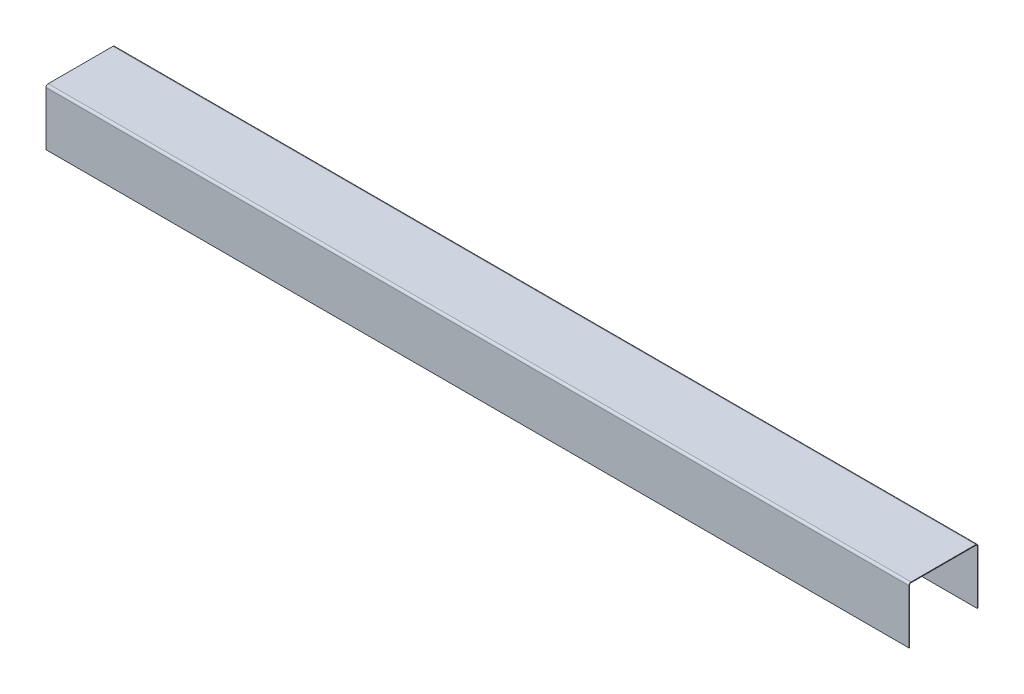
ISO-10303-21;
HEADER;
FILE_DESCRIPTION(('STEP AP214'),'2;1');
FILE_NAME('part.step','',(''),(''),'','','');
FILE_SCHEMA(('AUTOMOTIVE_DESIGN { 1 0 10303 214 1 1 1 1 }'));
ENDSEC;
DATA;
#1=APPLICATION_CONTEXT('core data for automotive mechanical design processes');
#2=APPLICATION_PROTOCOL_DEFINITION('international standard','automotive_design',2000,#1);
#3=PRODUCT_CONTEXT('',#1,'mechanical');
#4=PRODUCT('Part','Part','',(#3));
#5=PRODUCT_RELATED_PRODUCT_CATEGORY('part','',(#4));
#6=PRODUCT_DEFINITION_FORMATION('','',#4);
#7=PRODUCT_DEFINITION_CONTEXT('part definition',#1,'design');
#8=PRODUCT_DEFINITION('design','',#6,#7);
#9=PRODUCT_DEFINITION_SHAPE('','',#8);
#10=(LENGTH_UNIT() NAMED_UNIT(*) SI_UNIT(.MILLI.,.METRE.));
#11=(NAMED_UNIT(*) PLANE_ANGLE_UNIT() SI_UNIT($,.RADIAN.));
#12=(NAMED_UNIT(*) SI_UNIT($,.STERADIAN.) SOLID_ANGLE_UNIT());
#13=UNCERTAINTY_MEASURE_WITH_UNIT(LENGTH_MEASURE(1.E-05),#10,'distance_accuracy_value','');
#14=(GEOMETRIC_REPRESENTATION_CONTEXT(3) GLOBAL_UNCERTAINTY_ASSIGNED_CONTEXT((#13)) GLOBAL_UNIT_ASSIGNED_CONTEXT((#10,
#11,#12)) REPRESENTATION_CONTEXT('',''));
#15=CARTESIAN_POINT('',(0.,0.,0.));
#16=DIRECTION('',(0.,0.,1.));
#17=DIRECTION('',(1.,0.,0.));
#18=AXIS2_PLACEMENT_3D('',#15,#16,#17);
#19=CARTESIAN_POINT('',(0.,-65.,0.));
#20=DIRECTION('',(0.,-1.,0.));
#21=DIRECTION('',(0.,0.,-1.));
#22=AXIS2_PLACEMENT_3D('',#19,#20,#21);
#23=PLANE('',#22);
#24=DIRECTION('',(-1.,0.,0.));
#25=VECTOR('',#24,1.);
#26=CARTESIAN_POINT('',(0.,-65.,39.2));
#27=LINE('',#26,#25);
#28=CARTESIAN_POINT('',(990.,-65.,39.2));
#29=VERTEX_POINT('',#28);
#30=CARTESIAN_POINT('',(-9.99999999999999,-65.,39.2));
#31=VERTEX_POINT('',#30);
#32=EDGE_CURVE('E208',#29,#31,#27,.T.);
#33=ORIENTED_EDGE('',*,*,#32,.F.);
#34=DIRECTION('',(0.,0.,-1.));
#35=VECTOR('',#34,1.);
#36=CARTESIAN_POINT('',(990.,-65.,-39.9999999999999));
#37=LINE('',#36,#35);
#38=CARTESIAN_POINT('',(990.,-65.,39.9999999999999));
#39=VERTEX_POINT('',#38);
#40=EDGE_CURVE('E160',#39,#29,#37,.T.);
#41=ORIENTED_EDGE('',*,*,#40,.F.);
#42=DIRECTION('',(1.,0.,0.));
#43=VECTOR('',#42,1.);
#44=CARTESIAN_POINT('',(990.,-65.,39.9999999999999));
#45=LINE('',#44,#43);
#46=CARTESIAN_POINT('',(-9.99999999999999,-65.,40.));
#47=VERTEX_POINT('',#46);
#48=EDGE_CURVE('E171',#47,#39,#45,.T.);
#49=ORIENTED_EDGE('',*,*,#48,.F.);
#50=DIRECTION('',(0.,0.,1.));
#51=VECTOR('',#50,1.);
#52=CARTESIAN_POINT('',(-9.99999999999999,-65.,-40.));
#53=LINE('',#52,#51);
#54=EDGE_CURVE('E167',#31,#47,#53,.T.);
#55=ORIENTED_EDGE('',*,*,#54,.F.);
#56=EDGE_LOOP('',(#33,#41,#49,#55));
#57=FACE_BOUND('',#56,.T.);
#58=ADVANCED_FACE('F33',(#57),#23,.T.);
#59=CARTESIAN_POINT('',(990.,-65.,-39.9999999999999));
#60=DIRECTION('',(1.,0.,0.));
#61=DIRECTION('',(0.,0.,-1.));
#62=AXIS2_PLACEMENT_3D('',#59,#60,#61);
#63=PLANE('',#62);
#64=DIRECTION('',(0.,-1.,0.));
#65=VECTOR('',#64,1.);
#66=CARTESIAN_POINT('',(990.,-2.5,39.2));
#67=LINE('',#66,#65);
#68=CARTESIAN_POINT('',(990.,-2.5,39.2));
#69=VERTEX_POINT('',#68);
#70=EDGE_CURVE('E131',#69,#29,#67,.T.);
#71=ORIENTED_EDGE('',*,*,#70,.F.);
#72=CARTESIAN_POINT('',(990.,-2.5,37.5));
#73=DIRECTION('',(1.,0.,0.));
#74=DIRECTION('',(0.,0.,-1.));
#75=AXIS2_PLACEMENT_3D('',#72,#73,#74);
#76=CIRCLE('',#75,1.7);
#77=CARTESIAN_POINT('',(990.,-0.8,37.5));
#78=VERTEX_POINT('',#77);
#79=EDGE_CURVE('E145',#78,#69,#76,.T.);
#80=ORIENTED_EDGE('',*,*,#79,.F.);
#81=DIRECTION('',(0.,0.,1.));
#82=VECTOR('',#81,1.);
#83=CARTESIAN_POINT('',(990.,-0.799999999999999,-37.5));
#84=LINE('',#83,#82);
#85=CARTESIAN_POINT('',(990.,-0.799999999999999,-37.5));
#86=VERTEX_POINT('',#85);
#87=EDGE_CURVE('E143',#86,#78,#84,.T.);
#88=ORIENTED_EDGE('',*,*,#87,.F.);
#89=CARTESIAN_POINT('',(990.,-2.5,-37.5));
#90=DIRECTION('',(1.,0.,0.));
#91=DIRECTION('',(0.,0.,-1.));
#92=AXIS2_PLACEMENT_3D('',#89,#90,#91);
#93=CIRCLE('',#92,1.7);
#94=CARTESIAN_POINT('',(990.,-2.5,-39.2));
#95=VERTEX_POINT('',#94);
#96=EDGE_CURVE('E126',#95,#86,#93,.T.);
#97=ORIENTED_EDGE('',*,*,#96,.F.);
#98=DIRECTION('',(0.,1.,0.));
#99=VECTOR('',#98,1.);
#100=CARTESIAN_POINT('',(990.,-64.2,-39.2));
#101=LINE('',#100,#99);
#102=CARTESIAN_POINT('',(990.,-65.,-39.2));
#103=VERTEX_POINT('',#102);
#104=EDGE_CURVE('E134',#103,#95,#101,.T.);
#105=ORIENTED_EDGE('',*,*,#104,.F.);
#106=CARTESIAN_POINT('',(990.,-65.,-39.9999999999999));
#107=VERTEX_POINT('',#106);
#108=EDGE_CURVE('E164',#103,#107,#37,.T.);
#109=ORIENTED_EDGE('',*,*,#108,.T.);
#110=DIRECTION('',(0.,1.,0.));
#111=VECTOR('',#110,1.);
#112=CARTESIAN_POINT('',(990.,-65.,-39.9999999999999));
#113=LINE('',#112,#111);
#114=CARTESIAN_POINT('',(990.,-2.5,-39.9999999999999));
#115=VERTEX_POINT('',#114);
#116=EDGE_CURVE('E174',#107,#115,#113,.T.);
#117=ORIENTED_EDGE('',*,*,#116,.T.);
#118=CARTESIAN_POINT('',(990.,-2.5,-37.4999999999999));
#119=DIRECTION('',(1.,0.,0.));
#120=DIRECTION('',(0.,0.,-1.));
#121=AXIS2_PLACEMENT_3D('',#118,#119,#120);
#122=CIRCLE('',#121,2.5);
#123=CARTESIAN_POINT('',(990.,0.,-37.4999999999999));
#124=VERTEX_POINT('',#123);
#125=EDGE_CURVE('E203',#115,#124,#122,.T.);
#126=ORIENTED_EDGE('',*,*,#125,.T.);
#127=DIRECTION('',(0.,0.,-1.));
#128=VECTOR('',#127,1.);
#129=CARTESIAN_POINT('',(990.,0.,-39.9999999999999));
#130=LINE('',#129,#128);
#131=CARTESIAN_POINT('',(990.,0.,37.4999999999999));
#132=VERTEX_POINT('',#131);
#133=EDGE_CURVE('E159',#132,#124,#130,.T.);
#134=ORIENTED_EDGE('',*,*,#133,.F.);
#135=CARTESIAN_POINT('',(990.,-2.5,37.4999999999999));
#136=DIRECTION('',(1.,0.,0.));
#137=DIRECTION('',(0.,0.,-1.));
#138=AXIS2_PLACEMENT_3D('',#135,#136,#137);
#139=CIRCLE('',#138,2.5);
#140=CARTESIAN_POINT('',(990.,-2.5,39.9999999999999));
#141=VERTEX_POINT('',#140);
#142=EDGE_CURVE('E56',#132,#141,#139,.T.);
#143=ORIENTED_EDGE('',*,*,#142,.T.);
#144=DIRECTION('',(0.,1.,0.));
#145=VECTOR('',#144,1.);
#146=CARTESIAN_POINT('',(990.,-65.,39.9999999999999));
#147=LINE('',#146,#145);
#148=EDGE_CURVE('E180',#39,#141,#147,.T.);
#149=ORIENTED_EDGE('',*,*,#148,.F.);
#150=ORIENTED_EDGE('',*,*,#40,.T.);
#151=EDGE_LOOP('',(#71,#80,#88,#97,#105,#109,#117,#126,#134,#143,#149,#150));
#152=FACE_BOUND('',#151,.T.);
#153=ADVANCED_FACE('F140',(#152),#63,.T.);
#154=CARTESIAN_POINT('',(990.,-65.,39.9999999999999));
#155=DIRECTION('',(0.,0.,1.));
#156=DIRECTION('',(1.,0.,0.));
#157=AXIS2_PLACEMENT_3D('',#154,#155,#156);
#158=PLANE('',#157);
#159=ORIENTED_EDGE('',*,*,#148,.T.);
#160=DIRECTION('',(1.,0.,0.));
#161=VECTOR('',#160,1.);
#162=CARTESIAN_POINT('',(-9.99999999999999,-2.5,40.));
#163=LINE('',#162,#161);
#164=CARTESIAN_POINT('',(-9.99999999999999,-2.5,40.));
#165=VERTEX_POINT('',#164);
#166=EDGE_CURVE('E205',#141,#165,#163,.F.);
#167=ORIENTED_EDGE('',*,*,#166,.T.);
#168=DIRECTION('',(0.,1.,0.));
#169=VECTOR('',#168,1.);
#170=CARTESIAN_POINT('',(-9.99999999999999,-65.,40.));
#171=LINE('',#170,#169);
#172=EDGE_CURVE('E183',#47,#165,#171,.T.);
#173=ORIENTED_EDGE('',*,*,#172,.F.);
#174=ORIENTED_EDGE('',*,*,#48,.T.);
#175=EDGE_LOOP('',(#159,#167,#173,#174));
#176=FACE_BOUND('',#175,.T.);
#177=ADVANCED_FACE('F239',(#176),#158,.T.);
#178=CARTESIAN_POINT('',(-9.99999999999999,-65.,-40.));
#179=DIRECTION('',(-1.,0.,0.));
#180=DIRECTION('',(0.,0.,1.));
#181=AXIS2_PLACEMENT_3D('',#178,#179,#180);
#182=PLANE('',#181);
#183=DIRECTION('',(0.,1.,0.));
#184=VECTOR('',#183,1.);
#185=CARTESIAN_POINT('',(-9.99999999999999,-65.,39.2));
#186=LINE('',#185,#184);
#187=CARTESIAN_POINT('',(-9.99999999999999,-2.5,39.2));
#188=VERTEX_POINT('',#187);
#189=EDGE_CURVE('E157',#31,#188,#186,.T.);
#190=ORIENTED_EDGE('',*,*,#189,.F.);
#191=ORIENTED_EDGE('',*,*,#54,.T.);
#192=ORIENTED_EDGE('',*,*,#172,.T.);
#193=CARTESIAN_POINT('',(-9.99999999999999,-2.5,37.5));
#194=DIRECTION('',(-1.,0.,0.));
#195=DIRECTION('',(0.,0.,1.));
#196=AXIS2_PLACEMENT_3D('',#193,#194,#195);
#197=CIRCLE('',#196,2.5);
#198=CARTESIAN_POINT('',(-9.99999999999999,0.,37.5));
#199=VERTEX_POINT('',#198);
#200=EDGE_CURVE('E196',#165,#199,#197,.T.);
#201=ORIENTED_EDGE('',*,*,#200,.T.);
#202=DIRECTION('',(0.,0.,1.));
#203=VECTOR('',#202,1.);
#204=CARTESIAN_POINT('',(-9.99999999999999,0.,-40.));
#205=LINE('',#204,#203);
#206=CARTESIAN_POINT('',(-9.99999999999999,0.,-37.5));
#207=VERTEX_POINT('',#206);
#208=EDGE_CURVE('E177',#207,#199,#205,.T.);
#209=ORIENTED_EDGE('',*,*,#208,.F.);
#210=CARTESIAN_POINT('',(-9.99999999999999,-2.5,-37.5));
#211=DIRECTION('',(-1.,0.,0.));
#212=DIRECTION('',(0.,0.,1.));
#213=AXIS2_PLACEMENT_3D('',#210,#211,#212);
#214=CIRCLE('',#213,2.5);
#215=CARTESIAN_POINT('',(-9.99999999999999,-2.5,-40.));
#216=VERTEX_POINT('',#215);
#217=EDGE_CURVE('E198',#207,#216,#214,.T.);
#218=ORIENTED_EDGE('',*,*,#217,.T.);
#219=DIRECTION('',(0.,1.,0.));
#220=VECTOR('',#219,1.);
#221=CARTESIAN_POINT('',(-9.99999999999999,-65.,-40.));
#222=LINE('',#221,#220);
#223=CARTESIAN_POINT('',(-9.99999999999999,-65.,-40.));
#224=VERTEX_POINT('',#223);
#225=EDGE_CURVE('E186',#224,#216,#222,.T.);
#226=ORIENTED_EDGE('',*,*,#225,.F.);
#227=CARTESIAN_POINT('',(-9.99999999999999,-65.,-39.2));
#228=VERTEX_POINT('',#227);
#229=EDGE_CURVE('E168',#224,#228,#53,.T.);
#230=ORIENTED_EDGE('',*,*,#229,.T.);
#231=DIRECTION('',(0.,-1.,0.));
#232=VECTOR('',#231,1.);
#233=CARTESIAN_POINT('',(-9.99999999999999,-65.,-39.2));
#234=LINE('',#233,#232);
#235=CARTESIAN_POINT('',(-9.99999999999999,-2.5,-39.2));
#236=VERTEX_POINT('',#235);
#237=EDGE_CURVE('E48',#236,#228,#234,.T.);
#238=ORIENTED_EDGE('',*,*,#237,.F.);
#239=CARTESIAN_POINT('',(-9.99999999999999,-2.5,-37.5));
#240=DIRECTION('',(-1.,0.,0.));
#241=DIRECTION('',(0.,0.,1.));
#242=AXIS2_PLACEMENT_3D('',#239,#240,#241);
#243=CIRCLE('',#242,1.7);
#244=CARTESIAN_POINT('',(-9.99999999999999,-0.799999999999999,-37.5));
#245=VERTEX_POINT('',#244);
#246=EDGE_CURVE('E129',#245,#236,#243,.T.);
#247=ORIENTED_EDGE('',*,*,#246,.F.);
#248=DIRECTION('',(0.,0.,-1.));
#249=VECTOR('',#248,1.);
#250=CARTESIAN_POINT('',(-9.99999999999999,-0.799999999999995,-40.));
#251=LINE('',#250,#249);
#252=CARTESIAN_POINT('',(-9.99999999999999,-0.8,37.5));
#253=VERTEX_POINT('',#252);
#254=EDGE_CURVE('E41',#253,#245,#251,.T.);
#255=ORIENTED_EDGE('',*,*,#254,.F.);
#256=CARTESIAN_POINT('',(-9.99999999999999,-2.5,37.5));
#257=DIRECTION('',(-1.,0.,0.));
#258=DIRECTION('',(0.,0.,1.));
#259=AXIS2_PLACEMENT_3D('',#256,#257,#258);
#260=CIRCLE('',#259,1.7);
#261=EDGE_CURVE('E11',#188,#253,#260,.T.);
#262=ORIENTED_EDGE('',*,*,#261,.F.);
#263=EDGE_LOOP('',(#190,#191,#192,#201,#209,#218,#226,#230,#238,#247,#255,#262));
#264=FACE_BOUND('',#263,.T.);
#265=ADVANCED_FACE('F217',(#264),#182,.T.);
#266=CARTESIAN_POINT('',(990.,-65.,-39.9999999999999));
#267=DIRECTION('',(0.,0.,-1.));
#268=DIRECTION('',(-1.,0.,0.));
#269=AXIS2_PLACEMENT_3D('',#266,#267,#268);
#270=PLANE('',#269);
#271=ORIENTED_EDGE('',*,*,#225,.T.);
#272=DIRECTION('',(-1.,0.,0.));
#273=VECTOR('',#272,1.);
#274=CARTESIAN_POINT('',(990.,-2.5,-39.9999999999999));
#275=LINE('',#274,#273);
#276=EDGE_CURVE('E200',#216,#115,#275,.F.);
#277=ORIENTED_EDGE('',*,*,#276,.T.);
#278=ORIENTED_EDGE('',*,*,#116,.F.);
#279=DIRECTION('',(-1.,0.,0.));
#280=VECTOR('',#279,1.);
#281=CARTESIAN_POINT('',(990.,-65.,-39.9999999999999));
#282=LINE('',#281,#280);
#283=EDGE_CURVE('E163',#107,#224,#282,.T.);
#284=ORIENTED_EDGE('',*,*,#283,.T.);
#285=EDGE_LOOP('',(#271,#277,#278,#284));
#286=FACE_BOUND('',#285,.T.);
#287=ADVANCED_FACE('F224',(#286),#270,.T.);
#288=DIRECTION('',(1.,0.,0.));
#289=VECTOR('',#288,1.);
#290=CARTESIAN_POINT('',(0.,-65.,-39.2));
#291=LINE('',#290,#289);
#292=EDGE_CURVE('E136',#228,#103,#291,.T.);
#293=ORIENTED_EDGE('',*,*,#292,.F.);
#294=ORIENTED_EDGE('',*,*,#229,.F.);
#295=ORIENTED_EDGE('',*,*,#283,.F.);
#296=ORIENTED_EDGE('',*,*,#108,.F.);
#297=EDGE_LOOP('',(#293,#294,#295,#296));
#298=FACE_BOUND('',#297,.T.);
#299=ADVANCED_FACE('F221',(#298),#23,.T.);
#300=CARTESIAN_POINT('',(0.,0.,0.));
#301=DIRECTION('',(0.,-1.,0.));
#302=DIRECTION('',(0.,0.,-1.));
#303=AXIS2_PLACEMENT_3D('',#300,#301,#302);
#304=PLANE('',#303);
#305=ORIENTED_EDGE('',*,*,#133,.T.);
#306=DIRECTION('',(-1.,0.,0.));
#307=VECTOR('',#306,1.);
#308=CARTESIAN_POINT('',(-9.99999999999999,0.,-37.5));
#309=LINE('',#308,#307);
#310=EDGE_CURVE('E193',#124,#207,#309,.T.);
#311=ORIENTED_EDGE('',*,*,#310,.T.);
#312=ORIENTED_EDGE('',*,*,#208,.T.);
#313=DIRECTION('',(1.,0.,0.));
#314=VECTOR('',#313,1.);
#315=CARTESIAN_POINT('',(990.,0.,37.4999999999999));
#316=LINE('',#315,#314);
#317=EDGE_CURVE('E182',#199,#132,#316,.T.);
#318=ORIENTED_EDGE('',*,*,#317,.T.);
#319=EDGE_LOOP('',(#305,#311,#312,#318));
#320=FACE_BOUND('',#319,.T.);
#321=ADVANCED_FACE('F232',(#320),#304,.F.);
#322=CARTESIAN_POINT('',(0.,-2.5,-37.5));
#323=DIRECTION('',(1.,0.,0.));
#324=DIRECTION('',(0.,0.,-1.));
#325=AXIS2_PLACEMENT_3D('',#322,#323,#324);
#326=CYLINDRICAL_SURFACE('',#325,2.5);
#327=ORIENTED_EDGE('',*,*,#125,.F.);
#328=ORIENTED_EDGE('',*,*,#276,.F.);
#329=ORIENTED_EDGE('',*,*,#217,.F.);
#330=ORIENTED_EDGE('',*,*,#310,.F.);
#331=EDGE_LOOP('',(#327,#328,#329,#330));
#332=FACE_BOUND('',#331,.T.);
#333=ADVANCED_FACE('F229',(#332),#326,.T.);
#334=CARTESIAN_POINT('',(0.,-2.5,37.5));
#335=DIRECTION('',(-1.,0.,0.));
#336=DIRECTION('',(0.,0.,1.));
#337=AXIS2_PLACEMENT_3D('',#334,#335,#336);
#338=CYLINDRICAL_SURFACE('',#337,2.5);
#339=ORIENTED_EDGE('',*,*,#200,.F.);
#340=ORIENTED_EDGE('',*,*,#166,.F.);
#341=ORIENTED_EDGE('',*,*,#142,.F.);
#342=ORIENTED_EDGE('',*,*,#317,.F.);
#343=EDGE_LOOP('',(#339,#340,#341,#342));
#344=FACE_BOUND('',#343,.T.);
#345=ADVANCED_FACE('F35',(#344),#338,.T.);
#346=CARTESIAN_POINT('',(-65.,-67.2,39.2));
#347=DIRECTION('',(0.,0.,1.));
#348=DIRECTION('',(1.,0.,0.));
#349=AXIS2_PLACEMENT_3D('',#346,#347,#348);
#350=PLANE('',#349);
#351=ORIENTED_EDGE('',*,*,#189,.T.);
#352=DIRECTION('',(1.,0.,0.));
#353=VECTOR('',#352,1.);
#354=CARTESIAN_POINT('',(-65.,-2.5,39.2));
#355=LINE('',#354,#353);
#356=EDGE_CURVE('E151',#188,#69,#355,.T.);
#357=ORIENTED_EDGE('',*,*,#356,.T.);
#358=ORIENTED_EDGE('',*,*,#70,.T.);
#359=ORIENTED_EDGE('',*,*,#32,.T.);
#360=EDGE_LOOP('',(#351,#357,#358,#359));
#361=FACE_BOUND('',#360,.T.);
#362=ADVANCED_FACE('F246',(#361),#350,.F.);
#363=CARTESIAN_POINT('',(-65.,-2.5,37.5));
#364=DIRECTION('',(1.,0.,0.));
#365=DIRECTION('',(0.,0.,-1.));
#366=AXIS2_PLACEMENT_3D('',#363,#364,#365);
#367=CYLINDRICAL_SURFACE('',#366,1.7);
#368=ORIENTED_EDGE('',*,*,#261,.T.);
#369=DIRECTION('',(1.,0.,0.));
#370=VECTOR('',#369,1.);
#371=CARTESIAN_POINT('',(-65.,-0.8,37.5));
#372=LINE('',#371,#370);
#373=EDGE_CURVE('E153',#253,#78,#372,.T.);
#374=ORIENTED_EDGE('',*,*,#373,.T.);
#375=ORIENTED_EDGE('',*,*,#79,.T.);
#376=ORIENTED_EDGE('',*,*,#356,.F.);
#377=EDGE_LOOP('',(#368,#374,#375,#376));
#378=FACE_BOUND('',#377,.T.);
#379=ADVANCED_FACE('F249',(#378),#367,.F.);
#380=CARTESIAN_POINT('',(-65.,-0.799999999999999,-37.5));
#381=DIRECTION('',(0.,1.,0.));
#382=DIRECTION('',(0.,0.,1.));
#383=AXIS2_PLACEMENT_3D('',#380,#381,#382);
#384=PLANE('',#383);
#385=ORIENTED_EDGE('',*,*,#254,.T.);
#386=DIRECTION('',(1.,0.,0.));
#387=VECTOR('',#386,1.);
#388=CARTESIAN_POINT('',(-65.,-0.799999999999999,-37.5));
#389=LINE('',#388,#387);
#390=EDGE_CURVE('E130',#245,#86,#389,.T.);
#391=ORIENTED_EDGE('',*,*,#390,.T.);
#392=ORIENTED_EDGE('',*,*,#87,.T.);
#393=ORIENTED_EDGE('',*,*,#373,.F.);
#394=EDGE_LOOP('',(#385,#391,#392,#393));
#395=FACE_BOUND('',#394,.T.);
#396=ADVANCED_FACE('F213',(#395),#384,.F.);
#397=CARTESIAN_POINT('',(-65.,-2.5,-37.5));
#398=DIRECTION('',(1.,0.,0.));
#399=DIRECTION('',(0.,0.,-1.));
#400=AXIS2_PLACEMENT_3D('',#397,#398,#399);
#401=CYLINDRICAL_SURFACE('',#400,1.7);
#402=ORIENTED_EDGE('',*,*,#246,.T.);
#403=DIRECTION('',(1.,0.,0.));
#404=VECTOR('',#403,1.);
#405=CARTESIAN_POINT('',(-65.,-2.5,-39.2));
#406=LINE('',#405,#404);
#407=EDGE_CURVE('E121',#236,#95,#406,.T.);
#408=ORIENTED_EDGE('',*,*,#407,.T.);
#409=ORIENTED_EDGE('',*,*,#96,.T.);
#410=ORIENTED_EDGE('',*,*,#390,.F.);
#411=EDGE_LOOP('',(#402,#408,#409,#410));
#412=FACE_BOUND('',#411,.T.);
#413=ADVANCED_FACE('F123',(#412),#401,.F.);
#414=CARTESIAN_POINT('',(-65.,-64.2,-39.2));
#415=DIRECTION('',(0.,0.,-1.));
#416=DIRECTION('',(-1.,0.,0.));
#417=AXIS2_PLACEMENT_3D('',#414,#415,#416);
#418=PLANE('',#417);
#419=ORIENTED_EDGE('',*,*,#237,.T.);
#420=ORIENTED_EDGE('',*,*,#292,.T.);
#421=ORIENTED_EDGE('',*,*,#104,.T.);
#422=ORIENTED_EDGE('',*,*,#407,.F.);
#423=EDGE_LOOP('',(#419,#420,#421,#422));
#424=FACE_BOUND('',#423,.T.);
#425=ADVANCED_FACE('F135',(#424),#418,.F.);
#426=CLOSED_SHELL('',(#58,#153,#177,#265,#287,#299,#321,#333,#345,#362,#379,#396,#413,#425));
#427=MANIFOLD_SOLID_BREP('B2',#426);
#428=ADVANCED_BREP_SHAPE_REPRESENTATION('',(#18,#427),#14);
#429=SHAPE_DEFINITION_REPRESENTATION(#9,#428);
ENDSEC;
END-ISO-10303-21;
